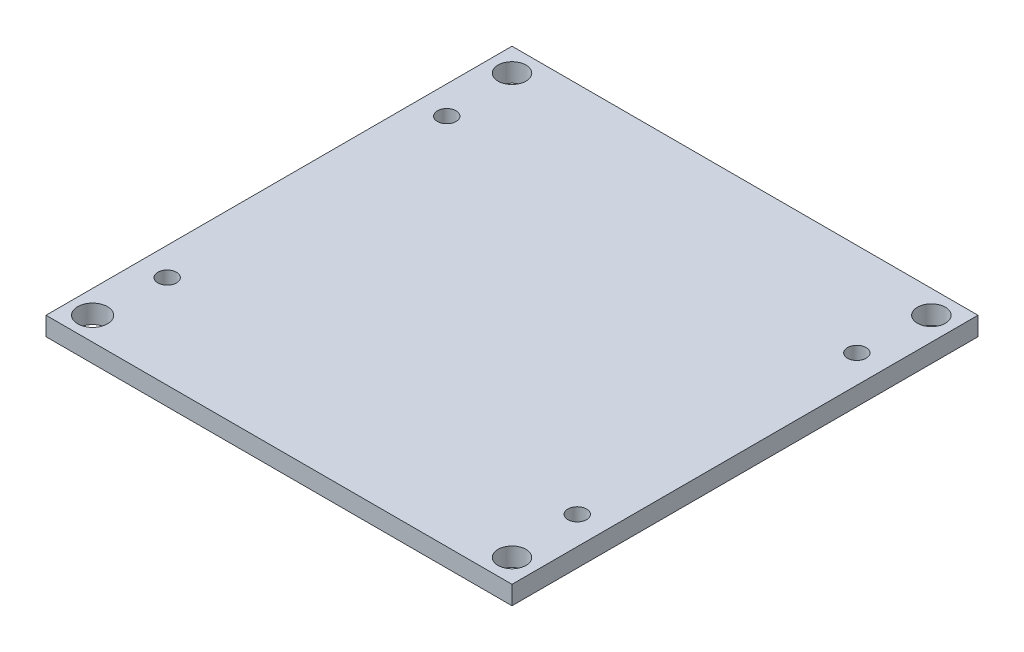
ISO-10303-21;
HEADER;
FILE_DESCRIPTION(('STEP AP214'),'2;1');
FILE_NAME('part.step','',(''),(''),'','','');
FILE_SCHEMA(('AUTOMOTIVE_DESIGN { 1 0 10303 214 1 1 1 1 }'));
ENDSEC;
DATA;
#1=APPLICATION_CONTEXT('core data for automotive mechanical design processes');
#2=APPLICATION_PROTOCOL_DEFINITION('international standard','automotive_design',2000,#1);
#3=PRODUCT_CONTEXT('',#1,'mechanical');
#4=PRODUCT('Part','Part','',(#3));
#5=PRODUCT_RELATED_PRODUCT_CATEGORY('part','',(#4));
#6=PRODUCT_DEFINITION_FORMATION('','',#4);
#7=PRODUCT_DEFINITION_CONTEXT('part definition',#1,'design');
#8=PRODUCT_DEFINITION('design','',#6,#7);
#9=PRODUCT_DEFINITION_SHAPE('','',#8);
#10=(LENGTH_UNIT() NAMED_UNIT(*) SI_UNIT(.MILLI.,.METRE.));
#11=(NAMED_UNIT(*) PLANE_ANGLE_UNIT() SI_UNIT($,.RADIAN.));
#12=(NAMED_UNIT(*) SI_UNIT($,.STERADIAN.) SOLID_ANGLE_UNIT());
#13=UNCERTAINTY_MEASURE_WITH_UNIT(LENGTH_MEASURE(1.E-05),#10,'distance_accuracy_value','');
#14=(GEOMETRIC_REPRESENTATION_CONTEXT(3) GLOBAL_UNCERTAINTY_ASSIGNED_CONTEXT((#13)) GLOBAL_UNIT_ASSIGNED_CONTEXT((#10,
#11,#12)) REPRESENTATION_CONTEXT('',''));
#15=CARTESIAN_POINT('',(0.,0.,0.));
#16=DIRECTION('',(0.,0.,1.));
#17=DIRECTION('',(1.,0.,0.));
#18=AXIS2_PLACEMENT_3D('',#15,#16,#17);
#19=CARTESIAN_POINT('',(0.,2.,0.));
#20=DIRECTION('',(1.,0.,0.));
#21=DIRECTION('',(0.,0.,-1.));
#22=AXIS2_PLACEMENT_3D('',#19,#20,#21);
#23=PLANE('',#22);
#24=DIRECTION('',(0.,0.,1.));
#25=VECTOR('',#24,1.);
#26=CARTESIAN_POINT('',(0.,0.,0.));
#27=LINE('',#26,#25);
#28=CARTESIAN_POINT('',(0.,0.,-50.));
#29=VERTEX_POINT('',#28);
#30=CARTESIAN_POINT('',(0.,0.,0.));
#31=VERTEX_POINT('',#30);
#32=EDGE_CURVE('E100',#29,#31,#27,.T.);
#33=ORIENTED_EDGE('',*,*,#32,.T.);
#34=DIRECTION('',(0.,-1.,0.));
#35=VECTOR('',#34,1.);
#36=CARTESIAN_POINT('',(0.,2.,0.));
#37=LINE('',#36,#35);
#38=CARTESIAN_POINT('',(0.,2.,0.));
#39=VERTEX_POINT('',#38);
#40=EDGE_CURVE('E11',#39,#31,#37,.T.);
#41=ORIENTED_EDGE('',*,*,#40,.F.);
#42=DIRECTION('',(0.,0.,1.));
#43=VECTOR('',#42,1.);
#44=CARTESIAN_POINT('',(0.,2.,0.));
#45=LINE('',#44,#43);
#46=CARTESIAN_POINT('',(0.,2.,-50.));
#47=VERTEX_POINT('',#46);
#48=EDGE_CURVE('E87',#47,#39,#45,.T.);
#49=ORIENTED_EDGE('',*,*,#48,.F.);
#50=DIRECTION('',(0.,-1.,0.));
#51=VECTOR('',#50,1.);
#52=CARTESIAN_POINT('',(0.,2.,-50.));
#53=LINE('',#52,#51);
#54=EDGE_CURVE('E96',#47,#29,#53,.T.);
#55=ORIENTED_EDGE('',*,*,#54,.T.);
#56=EDGE_LOOP('',(#33,#41,#49,#55));
#57=FACE_BOUND('',#56,.T.);
#58=ADVANCED_FACE('F34',(#57),#23,.F.);
#59=CARTESIAN_POINT('',(0.,2.,0.));
#60=DIRECTION('',(0.,0.,-1.));
#61=DIRECTION('',(-1.,0.,0.));
#62=AXIS2_PLACEMENT_3D('',#59,#60,#61);
#63=PLANE('',#62);
#64=DIRECTION('',(1.,0.,0.));
#65=VECTOR('',#64,1.);
#66=CARTESIAN_POINT('',(0.,0.,0.));
#67=LINE('',#66,#65);
#68=CARTESIAN_POINT('',(50.,0.,0.));
#69=VERTEX_POINT('',#68);
#70=EDGE_CURVE('E91',#31,#69,#67,.T.);
#71=ORIENTED_EDGE('',*,*,#70,.T.);
#72=DIRECTION('',(0.,-1.,0.));
#73=VECTOR('',#72,1.);
#74=CARTESIAN_POINT('',(50.,2.,0.));
#75=LINE('',#74,#73);
#76=CARTESIAN_POINT('',(50.,2.,0.));
#77=VERTEX_POINT('',#76);
#78=EDGE_CURVE('E43',#77,#69,#75,.T.);
#79=ORIENTED_EDGE('',*,*,#78,.F.);
#80=DIRECTION('',(1.,0.,0.));
#81=VECTOR('',#80,1.);
#82=CARTESIAN_POINT('',(0.,2.,0.));
#83=LINE('',#82,#81);
#84=EDGE_CURVE('E82',#39,#77,#83,.T.);
#85=ORIENTED_EDGE('',*,*,#84,.F.);
#86=ORIENTED_EDGE('',*,*,#40,.T.);
#87=EDGE_LOOP('',(#71,#79,#85,#86));
#88=FACE_BOUND('',#87,.T.);
#89=ADVANCED_FACE('F90',(#88),#63,.F.);
#90=CARTESIAN_POINT('',(50.,2.,0.));
#91=DIRECTION('',(-1.,0.,0.));
#92=DIRECTION('',(0.,0.,1.));
#93=AXIS2_PLACEMENT_3D('',#90,#91,#92);
#94=PLANE('',#93);
#95=DIRECTION('',(0.,0.,-1.));
#96=VECTOR('',#95,1.);
#97=CARTESIAN_POINT('',(50.,0.,0.));
#98=LINE('',#97,#96);
#99=CARTESIAN_POINT('',(50.,0.,-50.));
#100=VERTEX_POINT('',#99);
#101=EDGE_CURVE('E69',#69,#100,#98,.T.);
#102=ORIENTED_EDGE('',*,*,#101,.T.);
#103=DIRECTION('',(0.,-1.,0.));
#104=VECTOR('',#103,1.);
#105=CARTESIAN_POINT('',(50.,2.,-50.));
#106=LINE('',#105,#104);
#107=CARTESIAN_POINT('',(50.,2.,-50.));
#108=VERTEX_POINT('',#107);
#109=EDGE_CURVE('E92',#108,#100,#106,.T.);
#110=ORIENTED_EDGE('',*,*,#109,.F.);
#111=DIRECTION('',(0.,0.,-1.));
#112=VECTOR('',#111,1.);
#113=CARTESIAN_POINT('',(50.,2.,0.));
#114=LINE('',#113,#112);
#115=EDGE_CURVE('E85',#77,#108,#114,.T.);
#116=ORIENTED_EDGE('',*,*,#115,.F.);
#117=ORIENTED_EDGE('',*,*,#78,.T.);
#118=EDGE_LOOP('',(#102,#110,#116,#117));
#119=FACE_BOUND('',#118,.T.);
#120=ADVANCED_FACE('F94',(#119),#94,.F.);
#121=CARTESIAN_POINT('',(0.,2.,-50.));
#122=DIRECTION('',(0.,0.,1.));
#123=DIRECTION('',(1.,0.,0.));
#124=AXIS2_PLACEMENT_3D('',#121,#122,#123);
#125=PLANE('',#124);
#126=DIRECTION('',(-1.,0.,0.));
#127=VECTOR('',#126,1.);
#128=CARTESIAN_POINT('',(0.,0.,-50.));
#129=LINE('',#128,#127);
#130=EDGE_CURVE('E75',#100,#29,#129,.T.);
#131=ORIENTED_EDGE('',*,*,#130,.T.);
#132=ORIENTED_EDGE('',*,*,#54,.F.);
#133=DIRECTION('',(-1.,0.,0.));
#134=VECTOR('',#133,1.);
#135=CARTESIAN_POINT('',(0.,2.,-50.));
#136=LINE('',#135,#134);
#137=EDGE_CURVE('E52',#108,#47,#136,.T.);
#138=ORIENTED_EDGE('',*,*,#137,.F.);
#139=ORIENTED_EDGE('',*,*,#109,.T.);
#140=EDGE_LOOP('',(#131,#132,#138,#139));
#141=FACE_BOUND('',#140,.T.);
#142=ADVANCED_FACE('F168',(#141),#125,.F.);
#143=CARTESIAN_POINT('',(0.,2.,0.));
#144=DIRECTION('',(0.,-1.,0.));
#145=DIRECTION('',(0.,0.,-1.));
#146=AXIS2_PLACEMENT_3D('',#143,#144,#145);
#147=PLANE('',#146);
#148=CARTESIAN_POINT('',(3.00000000000001,2.,-10.));
#149=DIRECTION('',(0.,1.,0.));
#150=DIRECTION('',(0.,0.,1.));
#151=AXIS2_PLACEMENT_3D('',#148,#149,#150);
#152=CIRCLE('',#151,0.999999999999999);
#153=CARTESIAN_POINT('',(3.00000000000001,2.,-9.));
#154=VERTEX_POINT('',#153);
#155=EDGE_CURVE('E129',#154,#154,#152,.T.);
#156=ORIENTED_EDGE('',*,*,#155,.F.);
#157=EDGE_LOOP('',(#156));
#158=FACE_BOUND('',#157,.T.);
#159=CARTESIAN_POINT('',(3.00000000000001,2.,-40.));
#160=DIRECTION('',(0.,1.,0.));
#161=DIRECTION('',(0.,0.,1.));
#162=AXIS2_PLACEMENT_3D('',#159,#160,#161);
#163=CIRCLE('',#162,0.999999999999999);
#164=CARTESIAN_POINT('',(3.00000000000001,2.,-39.));
#165=VERTEX_POINT('',#164);
#166=EDGE_CURVE('E119',#165,#165,#163,.T.);
#167=ORIENTED_EDGE('',*,*,#166,.F.);
#168=EDGE_LOOP('',(#167));
#169=FACE_BOUND('',#168,.T.);
#170=CARTESIAN_POINT('',(47.,2.,-40.));
#171=DIRECTION('',(0.,1.,0.));
#172=DIRECTION('',(0.,0.,1.));
#173=AXIS2_PLACEMENT_3D('',#170,#171,#172);
#174=CIRCLE('',#173,1.);
#175=CARTESIAN_POINT('',(47.,2.,-39.));
#176=VERTEX_POINT('',#175);
#177=EDGE_CURVE('E116',#176,#176,#174,.T.);
#178=ORIENTED_EDGE('',*,*,#177,.F.);
#179=EDGE_LOOP('',(#178));
#180=FACE_BOUND('',#179,.T.);
#181=CARTESIAN_POINT('',(47.,2.,-10.));
#182=DIRECTION('',(0.,1.,0.));
#183=DIRECTION('',(0.,0.,1.));
#184=AXIS2_PLACEMENT_3D('',#181,#182,#183);
#185=CIRCLE('',#184,1.);
#186=CARTESIAN_POINT('',(47.,2.,-9.));
#187=VERTEX_POINT('',#186);
#188=EDGE_CURVE('E113',#187,#187,#185,.T.);
#189=ORIENTED_EDGE('',*,*,#188,.F.);
#190=EDGE_LOOP('',(#189));
#191=FACE_BOUND('',#190,.T.);
#192=CARTESIAN_POINT('',(47.5,2.,-2.5));
#193=DIRECTION('',(0.,1.,0.));
#194=DIRECTION('',(0.,0.,1.));
#195=AXIS2_PLACEMENT_3D('',#192,#193,#194);
#196=CIRCLE('',#195,1.5);
#197=CARTESIAN_POINT('',(47.5,2.,-1.));
#198=VERTEX_POINT('',#197);
#199=EDGE_CURVE('E112',#198,#198,#196,.T.);
#200=ORIENTED_EDGE('',*,*,#199,.F.);
#201=EDGE_LOOP('',(#200));
#202=FACE_BOUND('',#201,.T.);
#203=CARTESIAN_POINT('',(47.5,2.,-47.5));
#204=DIRECTION('',(0.,1.,0.));
#205=DIRECTION('',(0.,0.,1.));
#206=AXIS2_PLACEMENT_3D('',#203,#204,#205);
#207=CIRCLE('',#206,1.5);
#208=CARTESIAN_POINT('',(47.5,2.,-46.));
#209=VERTEX_POINT('',#208);
#210=EDGE_CURVE('E139',#209,#209,#207,.T.);
#211=ORIENTED_EDGE('',*,*,#210,.F.);
#212=EDGE_LOOP('',(#211));
#213=FACE_BOUND('',#212,.T.);
#214=CARTESIAN_POINT('',(2.5,2.,-47.5));
#215=DIRECTION('',(0.,1.,0.));
#216=DIRECTION('',(0.,0.,1.));
#217=AXIS2_PLACEMENT_3D('',#214,#215,#216);
#218=CIRCLE('',#217,1.5);
#219=CARTESIAN_POINT('',(2.5,2.,-46.));
#220=VERTEX_POINT('',#219);
#221=EDGE_CURVE('E145',#220,#220,#218,.T.);
#222=ORIENTED_EDGE('',*,*,#221,.F.);
#223=EDGE_LOOP('',(#222));
#224=FACE_BOUND('',#223,.T.);
#225=CARTESIAN_POINT('',(2.5,2.,-2.5));
#226=DIRECTION('',(0.,1.,0.));
#227=DIRECTION('',(0.,0.,1.));
#228=AXIS2_PLACEMENT_3D('',#225,#226,#227);
#229=CIRCLE('',#228,1.59999999999999);
#230=CARTESIAN_POINT('',(2.5,2.,-0.900000000000013));
#231=VERTEX_POINT('',#230);
#232=EDGE_CURVE('E151',#231,#231,#229,.T.);
#233=ORIENTED_EDGE('',*,*,#232,.F.);
#234=EDGE_LOOP('',(#233));
#235=FACE_BOUND('',#234,.T.);
#236=ORIENTED_EDGE('',*,*,#48,.T.);
#237=ORIENTED_EDGE('',*,*,#84,.T.);
#238=ORIENTED_EDGE('',*,*,#115,.T.);
#239=ORIENTED_EDGE('',*,*,#137,.T.);
#240=EDGE_LOOP('',(#236,#237,#238,#239));
#241=FACE_BOUND('',#240,.T.);
#242=ADVANCED_FACE('F83',(#158,#169,#180,#191,#202,#213,#224,#235,#241),#147,.F.);
#243=CARTESIAN_POINT('',(0.,0.,0.));
#244=DIRECTION('',(0.,-1.,0.));
#245=DIRECTION('',(0.,0.,-1.));
#246=AXIS2_PLACEMENT_3D('',#243,#244,#245);
#247=PLANE('',#246);
#248=CARTESIAN_POINT('',(3.00000000000001,0.,-10.));
#249=DIRECTION('',(0.,-1.,0.));
#250=DIRECTION('',(0.,0.,-1.));
#251=AXIS2_PLACEMENT_3D('',#248,#249,#250);
#252=CIRCLE('',#251,0.999999999999998);
#253=CARTESIAN_POINT('',(3.00000000000001,0.,-11.));
#254=VERTEX_POINT('',#253);
#255=EDGE_CURVE('E37',#254,#254,#252,.T.);
#256=ORIENTED_EDGE('',*,*,#255,.F.);
#257=EDGE_LOOP('',(#256));
#258=FACE_BOUND('',#257,.T.);
#259=CARTESIAN_POINT('',(3.00000000000001,0.,-40.));
#260=DIRECTION('',(0.,-1.,0.));
#261=DIRECTION('',(0.,0.,-1.));
#262=AXIS2_PLACEMENT_3D('',#259,#260,#261);
#263=CIRCLE('',#262,0.999999999999998);
#264=CARTESIAN_POINT('',(3.00000000000001,0.,-41.));
#265=VERTEX_POINT('',#264);
#266=EDGE_CURVE('E117',#265,#265,#263,.T.);
#267=ORIENTED_EDGE('',*,*,#266,.F.);
#268=EDGE_LOOP('',(#267));
#269=FACE_BOUND('',#268,.T.);
#270=CARTESIAN_POINT('',(47.,0.,-40.));
#271=DIRECTION('',(0.,-1.,0.));
#272=DIRECTION('',(0.,0.,-1.));
#273=AXIS2_PLACEMENT_3D('',#270,#271,#272);
#274=CIRCLE('',#273,0.999999999999997);
#275=CARTESIAN_POINT('',(47.,0.,-41.));
#276=VERTEX_POINT('',#275);
#277=EDGE_CURVE('E114',#276,#276,#274,.T.);
#278=ORIENTED_EDGE('',*,*,#277,.F.);
#279=EDGE_LOOP('',(#278));
#280=FACE_BOUND('',#279,.T.);
#281=CARTESIAN_POINT('',(47.,0.,-10.));
#282=DIRECTION('',(0.,-1.,0.));
#283=DIRECTION('',(0.,0.,-1.));
#284=AXIS2_PLACEMENT_3D('',#281,#282,#283);
#285=CIRCLE('',#284,0.999999999999997);
#286=CARTESIAN_POINT('',(47.,0.,-11.));
#287=VERTEX_POINT('',#286);
#288=EDGE_CURVE('E109',#287,#287,#285,.T.);
#289=ORIENTED_EDGE('',*,*,#288,.F.);
#290=EDGE_LOOP('',(#289));
#291=FACE_BOUND('',#290,.T.);
#292=CARTESIAN_POINT('',(47.5,0.,-2.5));
#293=DIRECTION('',(0.,1.,0.));
#294=DIRECTION('',(0.,0.,1.));
#295=AXIS2_PLACEMENT_3D('',#292,#293,#294);
#296=CIRCLE('',#295,1.5);
#297=CARTESIAN_POINT('',(47.5,0.,-1.));
#298=VERTEX_POINT('',#297);
#299=EDGE_CURVE('E136',#298,#298,#296,.T.);
#300=ORIENTED_EDGE('',*,*,#299,.T.);
#301=EDGE_LOOP('',(#300));
#302=FACE_BOUND('',#301,.T.);
#303=CARTESIAN_POINT('',(47.5,0.,-47.5));
#304=DIRECTION('',(0.,1.,0.));
#305=DIRECTION('',(0.,0.,1.));
#306=AXIS2_PLACEMENT_3D('',#303,#304,#305);
#307=CIRCLE('',#306,1.5);
#308=CARTESIAN_POINT('',(47.5,0.,-46.));
#309=VERTEX_POINT('',#308);
#310=EDGE_CURVE('E142',#309,#309,#307,.T.);
#311=ORIENTED_EDGE('',*,*,#310,.T.);
#312=EDGE_LOOP('',(#311));
#313=FACE_BOUND('',#312,.T.);
#314=CARTESIAN_POINT('',(2.5,0.,-47.5));
#315=DIRECTION('',(0.,1.,0.));
#316=DIRECTION('',(0.,0.,1.));
#317=AXIS2_PLACEMENT_3D('',#314,#315,#316);
#318=CIRCLE('',#317,1.5);
#319=CARTESIAN_POINT('',(2.5,0.,-46.));
#320=VERTEX_POINT('',#319);
#321=EDGE_CURVE('E148',#320,#320,#318,.T.);
#322=ORIENTED_EDGE('',*,*,#321,.T.);
#323=EDGE_LOOP('',(#322));
#324=FACE_BOUND('',#323,.T.);
#325=CARTESIAN_POINT('',(2.5,0.,-2.5));
#326=DIRECTION('',(0.,1.,0.));
#327=DIRECTION('',(0.,0.,1.));
#328=AXIS2_PLACEMENT_3D('',#325,#326,#327);
#329=CIRCLE('',#328,1.6);
#330=CARTESIAN_POINT('',(2.5,0.,-0.900000000000001));
#331=VERTEX_POINT('',#330);
#332=EDGE_CURVE('E103',#331,#331,#329,.T.);
#333=ORIENTED_EDGE('',*,*,#332,.T.);
#334=EDGE_LOOP('',(#333));
#335=FACE_BOUND('',#334,.T.);
#336=ORIENTED_EDGE('',*,*,#32,.F.);
#337=ORIENTED_EDGE('',*,*,#130,.F.);
#338=ORIENTED_EDGE('',*,*,#101,.F.);
#339=ORIENTED_EDGE('',*,*,#70,.F.);
#340=EDGE_LOOP('',(#336,#337,#338,#339));
#341=FACE_BOUND('',#340,.T.);
#342=ADVANCED_FACE('F157',(#258,#269,#280,#291,#302,#313,#324,#335,#341),#247,.T.);
#343=CARTESIAN_POINT('',(2.5,2.,-2.5));
#344=DIRECTION('',(0.,1.,0.));
#345=DIRECTION('',(0.,0.,1.));
#346=AXIS2_PLACEMENT_3D('',#343,#344,#345);
#347=CYLINDRICAL_SURFACE('',#346,1.59999999999999);
#348=ORIENTED_EDGE('',*,*,#332,.F.);
#349=EDGE_LOOP('',(#348));
#350=FACE_BOUND('',#349,.T.);
#351=ORIENTED_EDGE('',*,*,#232,.T.);
#352=EDGE_LOOP('',(#351));
#353=FACE_BOUND('',#352,.T.);
#354=ADVANCED_FACE('F160',(#350,#353),#347,.F.);
#355=CARTESIAN_POINT('',(2.5,2.,-47.5));
#356=DIRECTION('',(0.,1.,0.));
#357=DIRECTION('',(0.,0.,1.));
#358=AXIS2_PLACEMENT_3D('',#355,#356,#357);
#359=CYLINDRICAL_SURFACE('',#358,1.5);
#360=ORIENTED_EDGE('',*,*,#321,.F.);
#361=EDGE_LOOP('',(#360));
#362=FACE_BOUND('',#361,.T.);
#363=ORIENTED_EDGE('',*,*,#221,.T.);
#364=EDGE_LOOP('',(#363));
#365=FACE_BOUND('',#364,.T.);
#366=ADVANCED_FACE('F163',(#362,#365),#359,.F.);
#367=CARTESIAN_POINT('',(47.5,2.,-47.5));
#368=DIRECTION('',(0.,1.,0.));
#369=DIRECTION('',(0.,0.,1.));
#370=AXIS2_PLACEMENT_3D('',#367,#368,#369);
#371=CYLINDRICAL_SURFACE('',#370,1.5);
#372=ORIENTED_EDGE('',*,*,#310,.F.);
#373=EDGE_LOOP('',(#372));
#374=FACE_BOUND('',#373,.T.);
#375=ORIENTED_EDGE('',*,*,#210,.T.);
#376=EDGE_LOOP('',(#375));
#377=FACE_BOUND('',#376,.T.);
#378=ADVANCED_FACE('F213',(#374,#377),#371,.F.);
#379=CARTESIAN_POINT('',(47.5,2.,-2.5));
#380=DIRECTION('',(0.,1.,0.));
#381=DIRECTION('',(0.,0.,1.));
#382=AXIS2_PLACEMENT_3D('',#379,#380,#381);
#383=CYLINDRICAL_SURFACE('',#382,1.5);
#384=ORIENTED_EDGE('',*,*,#299,.F.);
#385=EDGE_LOOP('',(#384));
#386=FACE_BOUND('',#385,.T.);
#387=ORIENTED_EDGE('',*,*,#199,.T.);
#388=EDGE_LOOP('',(#387));
#389=FACE_BOUND('',#388,.T.);
#390=ADVANCED_FACE('F223',(#386,#389),#383,.F.);
#391=CARTESIAN_POINT('',(47.,2.,-10.));
#392=DIRECTION('',(0.,1.,0.));
#393=DIRECTION('',(0.,0.,1.));
#394=AXIS2_PLACEMENT_3D('',#391,#392,#393);
#395=CYLINDRICAL_SURFACE('',#394,0.999999999999997);
#396=ORIENTED_EDGE('',*,*,#288,.T.);
#397=EDGE_LOOP('',(#396));
#398=FACE_BOUND('',#397,.T.);
#399=ORIENTED_EDGE('',*,*,#188,.T.);
#400=EDGE_LOOP('',(#399));
#401=FACE_BOUND('',#400,.T.);
#402=ADVANCED_FACE('F232',(#398,#401),#395,.F.);
#403=CARTESIAN_POINT('',(47.,2.,-40.));
#404=DIRECTION('',(0.,1.,0.));
#405=DIRECTION('',(0.,0.,1.));
#406=AXIS2_PLACEMENT_3D('',#403,#404,#405);
#407=CYLINDRICAL_SURFACE('',#406,0.999999999999997);
#408=ORIENTED_EDGE('',*,*,#277,.T.);
#409=EDGE_LOOP('',(#408));
#410=FACE_BOUND('',#409,.T.);
#411=ORIENTED_EDGE('',*,*,#177,.T.);
#412=EDGE_LOOP('',(#411));
#413=FACE_BOUND('',#412,.T.);
#414=ADVANCED_FACE('F251',(#410,#413),#407,.F.);
#415=CARTESIAN_POINT('',(3.00000000000001,2.,-40.));
#416=DIRECTION('',(0.,1.,0.));
#417=DIRECTION('',(0.,0.,1.));
#418=AXIS2_PLACEMENT_3D('',#415,#416,#417);
#419=CYLINDRICAL_SURFACE('',#418,0.999999999999998);
#420=ORIENTED_EDGE('',*,*,#266,.T.);
#421=EDGE_LOOP('',(#420));
#422=FACE_BOUND('',#421,.T.);
#423=ORIENTED_EDGE('',*,*,#166,.T.);
#424=EDGE_LOOP('',(#423));
#425=FACE_BOUND('',#424,.T.);
#426=ADVANCED_FACE('F261',(#422,#425),#419,.F.);
#427=CARTESIAN_POINT('',(3.00000000000001,2.,-10.));
#428=DIRECTION('',(0.,1.,0.));
#429=DIRECTION('',(0.,0.,1.));
#430=AXIS2_PLACEMENT_3D('',#427,#428,#429);
#431=CYLINDRICAL_SURFACE('',#430,0.999999999999998);
#432=ORIENTED_EDGE('',*,*,#255,.T.);
#433=EDGE_LOOP('',(#432));
#434=FACE_BOUND('',#433,.T.);
#435=ORIENTED_EDGE('',*,*,#155,.T.);
#436=EDGE_LOOP('',(#435));
#437=FACE_BOUND('',#436,.T.);
#438=ADVANCED_FACE('F271',(#434,#437),#431,.F.);
#439=CLOSED_SHELL('',(#58,#89,#120,#142,#242,#342,#354,#366,#378,#390,#402,#414,#426,#438));
#440=MANIFOLD_SOLID_BREP('B2',#439);
#441=ADVANCED_BREP_SHAPE_REPRESENTATION('',(#18,#440),#14);
#442=SHAPE_DEFINITION_REPRESENTATION(#9,#441);
ENDSEC;
END-ISO-10303-21;
